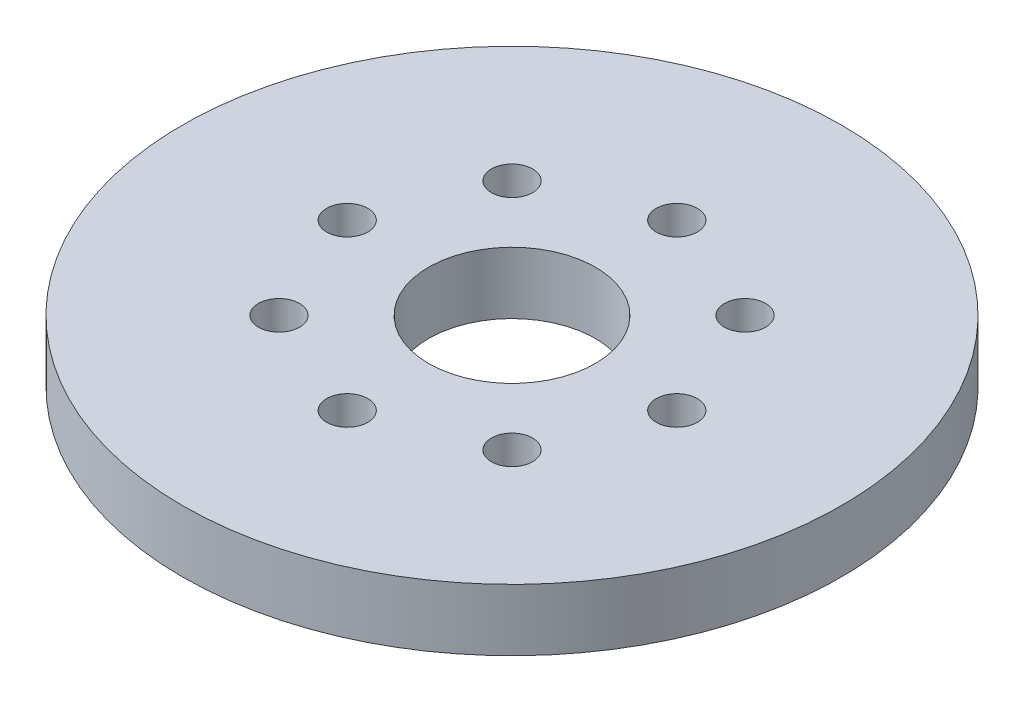
ISO-10303-21;
HEADER;
FILE_DESCRIPTION(('STEP AP214'),'2;1');
FILE_NAME('part.step','',(''),(''),'','','');
FILE_SCHEMA(('AUTOMOTIVE_DESIGN { 1 0 10303 214 1 1 1 1 }'));
ENDSEC;
DATA;
#1=APPLICATION_CONTEXT('core data for automotive mechanical design processes');
#2=APPLICATION_PROTOCOL_DEFINITION('international standard','automotive_design',2000,#1);
#3=PRODUCT_CONTEXT('',#1,'mechanical');
#4=PRODUCT('Part','Part','',(#3));
#5=PRODUCT_RELATED_PRODUCT_CATEGORY('part','',(#4));
#6=PRODUCT_DEFINITION_FORMATION('','',#4);
#7=PRODUCT_DEFINITION_CONTEXT('part definition',#1,'design');
#8=PRODUCT_DEFINITION('design','',#6,#7);
#9=PRODUCT_DEFINITION_SHAPE('','',#8);
#10=(LENGTH_UNIT() NAMED_UNIT(*) SI_UNIT(.MILLI.,.METRE.));
#11=(NAMED_UNIT(*) PLANE_ANGLE_UNIT() SI_UNIT($,.RADIAN.));
#12=(NAMED_UNIT(*) SI_UNIT($,.STERADIAN.) SOLID_ANGLE_UNIT());
#13=UNCERTAINTY_MEASURE_WITH_UNIT(LENGTH_MEASURE(1.E-05),#10,'distance_accuracy_value','');
#14=(GEOMETRIC_REPRESENTATION_CONTEXT(3) GLOBAL_UNCERTAINTY_ASSIGNED_CONTEXT((#13)) GLOBAL_UNIT_ASSIGNED_CONTEXT((#10,
#11,#12)) REPRESENTATION_CONTEXT('',''));
#15=CARTESIAN_POINT('',(0.,0.,0.));
#16=DIRECTION('',(0.,0.,1.));
#17=DIRECTION('',(1.,0.,0.));
#18=AXIS2_PLACEMENT_3D('',#15,#16,#17);
#19=CARTESIAN_POINT('',(0.,3.,0.));
#20=DIRECTION('',(0.,1.,0.));
#21=DIRECTION('',(0.,0.,1.));
#22=AXIS2_PLACEMENT_3D('',#19,#20,#21);
#23=PLANE('',#22);
#24=CARTESIAN_POINT('',(-8.,3.,0.));
#25=DIRECTION('',(0.,1.,0.));
#26=DIRECTION('',(0.,0.,1.));
#27=AXIS2_PLACEMENT_3D('',#24,#25,#26);
#28=CIRCLE('',#27,1.);
#29=CARTESIAN_POINT('',(-8.,3.,0.999999999999917));
#30=VERTEX_POINT('',#29);
#31=EDGE_CURVE('E85',#30,#30,#28,.T.);
#32=ORIENTED_EDGE('',*,*,#31,.F.);
#33=EDGE_LOOP('',(#32));
#34=FACE_BOUND('',#33,.T.);
#35=CARTESIAN_POINT('',(0.,3.,8.));
#36=DIRECTION('',(0.,1.,0.));
#37=DIRECTION('',(0.,0.,1.));
#38=AXIS2_PLACEMENT_3D('',#35,#36,#37);
#39=CIRCLE('',#38,1.);
#40=CARTESIAN_POINT('',(0.,3.,9.));
#41=VERTEX_POINT('',#40);
#42=EDGE_CURVE('E73',#41,#41,#39,.T.);
#43=ORIENTED_EDGE('',*,*,#42,.F.);
#44=EDGE_LOOP('',(#43));
#45=FACE_BOUND('',#44,.T.);
#46=CARTESIAN_POINT('',(8.,3.,0.));
#47=DIRECTION('',(0.,1.,0.));
#48=DIRECTION('',(0.,0.,1.));
#49=AXIS2_PLACEMENT_3D('',#46,#47,#48);
#50=CIRCLE('',#49,1.);
#51=CARTESIAN_POINT('',(8.,3.,1.00000000000003));
#52=VERTEX_POINT('',#51);
#53=EDGE_CURVE('E61',#52,#52,#50,.T.);
#54=ORIENTED_EDGE('',*,*,#53,.F.);
#55=EDGE_LOOP('',(#54));
#56=FACE_BOUND('',#55,.T.);
#57=CARTESIAN_POINT('',(0.,3.,-8.));
#58=DIRECTION('',(0.,1.,0.));
#59=DIRECTION('',(0.,0.,1.));
#60=AXIS2_PLACEMENT_3D('',#57,#58,#59);
#61=CIRCLE('',#60,1.);
#62=CARTESIAN_POINT('',(0.,3.,-7.));
#63=VERTEX_POINT('',#62);
#64=EDGE_CURVE('E49',#63,#63,#61,.T.);
#65=ORIENTED_EDGE('',*,*,#64,.F.);
#66=EDGE_LOOP('',(#65));
#67=FACE_BOUND('',#66,.T.);
#68=CARTESIAN_POINT('',(0.,3.,0.));
#69=DIRECTION('',(0.,1.,0.));
#70=DIRECTION('',(0.,0.,1.));
#71=AXIS2_PLACEMENT_3D('',#68,#69,#70);
#72=CIRCLE('',#71,16.);
#73=CARTESIAN_POINT('',(0.,3.,16.));
#74=VERTEX_POINT('',#73);
#75=EDGE_CURVE('E10',#74,#74,#72,.T.);
#76=ORIENTED_EDGE('',*,*,#75,.T.);
#77=EDGE_LOOP('',(#76));
#78=FACE_BOUND('',#77,.T.);
#79=CARTESIAN_POINT('',(0.,3.,0.));
#80=DIRECTION('',(0.,1.,0.));
#81=DIRECTION('',(0.,0.,1.));
#82=AXIS2_PLACEMENT_3D('',#79,#80,#81);
#83=CIRCLE('',#82,4.05);
#84=CARTESIAN_POINT('',(0.,3.,4.05));
#85=VERTEX_POINT('',#84);
#86=EDGE_CURVE('E44',#85,#85,#83,.T.);
#87=ORIENTED_EDGE('',*,*,#86,.F.);
#88=EDGE_LOOP('',(#87));
#89=FACE_BOUND('',#88,.T.);
#90=CARTESIAN_POINT('',(5.65685424949239,3.,-5.65685424949237));
#91=DIRECTION('',(0.,1.,0.));
#92=DIRECTION('',(0.,0.,1.));
#93=AXIS2_PLACEMENT_3D('',#90,#91,#92);
#94=CIRCLE('',#93,1.);
#95=CARTESIAN_POINT('',(5.65685424949239,3.,-4.65685424949237));
#96=VERTEX_POINT('',#95);
#97=EDGE_CURVE('E55',#96,#96,#94,.T.);
#98=ORIENTED_EDGE('',*,*,#97,.F.);
#99=EDGE_LOOP('',(#98));
#100=FACE_BOUND('',#99,.T.);
#101=CARTESIAN_POINT('',(5.65685424949235,3.,5.65685424949241));
#102=DIRECTION('',(0.,1.,0.));
#103=DIRECTION('',(0.,0.,1.));
#104=AXIS2_PLACEMENT_3D('',#101,#102,#103);
#105=CIRCLE('',#104,1.);
#106=CARTESIAN_POINT('',(5.65685424949235,3.,6.65685424949241));
#107=VERTEX_POINT('',#106);
#108=EDGE_CURVE('E67',#107,#107,#105,.T.);
#109=ORIENTED_EDGE('',*,*,#108,.F.);
#110=EDGE_LOOP('',(#109));
#111=FACE_BOUND('',#110,.T.);
#112=CARTESIAN_POINT('',(-5.65685424949243,3.,5.65685424949233));
#113=DIRECTION('',(0.,1.,0.));
#114=DIRECTION('',(0.,0.,1.));
#115=AXIS2_PLACEMENT_3D('',#112,#113,#114);
#116=CIRCLE('',#115,1.);
#117=CARTESIAN_POINT('',(-5.65685424949243,3.,6.65685424949233));
#118=VERTEX_POINT('',#117);
#119=EDGE_CURVE('E79',#118,#118,#116,.T.);
#120=ORIENTED_EDGE('',*,*,#119,.F.);
#121=EDGE_LOOP('',(#120));
#122=FACE_BOUND('',#121,.T.);
#123=CARTESIAN_POINT('',(-5.65685424949231,3.,-5.65685424949245));
#124=DIRECTION('',(0.,1.,0.));
#125=DIRECTION('',(0.,0.,1.));
#126=AXIS2_PLACEMENT_3D('',#123,#124,#125);
#127=CIRCLE('',#126,1.);
#128=CARTESIAN_POINT('',(-5.65685424949231,3.,-4.65685424949245));
#129=VERTEX_POINT('',#128);
#130=EDGE_CURVE('E91',#129,#129,#127,.T.);
#131=ORIENTED_EDGE('',*,*,#130,.F.);
#132=EDGE_LOOP('',(#131));
#133=FACE_BOUND('',#132,.T.);
#134=ADVANCED_FACE('F33',(#34,#45,#56,#67,#78,#89,#100,#111,#122,#133),#23,.T.);
#135=CARTESIAN_POINT('',(0.,0.,0.));
#136=DIRECTION('',(0.,1.,0.));
#137=DIRECTION('',(0.,0.,1.));
#138=AXIS2_PLACEMENT_3D('',#135,#136,#137);
#139=PLANE('',#138);
#140=CARTESIAN_POINT('',(-8.,0.,0.));
#141=DIRECTION('',(0.,1.,0.));
#142=DIRECTION('',(0.,0.,1.));
#143=AXIS2_PLACEMENT_3D('',#140,#141,#142);
#144=CIRCLE('',#143,1.);
#145=CARTESIAN_POINT('',(-8.,0.,0.999999999999917));
#146=VERTEX_POINT('',#145);
#147=EDGE_CURVE('E88',#146,#146,#144,.T.);
#148=ORIENTED_EDGE('',*,*,#147,.T.);
#149=EDGE_LOOP('',(#148));
#150=FACE_BOUND('',#149,.T.);
#151=CARTESIAN_POINT('',(0.,0.,8.));
#152=DIRECTION('',(0.,1.,0.));
#153=DIRECTION('',(0.,0.,1.));
#154=AXIS2_PLACEMENT_3D('',#151,#152,#153);
#155=CIRCLE('',#154,1.);
#156=CARTESIAN_POINT('',(0.,0.,9.));
#157=VERTEX_POINT('',#156);
#158=EDGE_CURVE('E76',#157,#157,#155,.T.);
#159=ORIENTED_EDGE('',*,*,#158,.T.);
#160=EDGE_LOOP('',(#159));
#161=FACE_BOUND('',#160,.T.);
#162=CARTESIAN_POINT('',(8.,0.,0.));
#163=DIRECTION('',(0.,1.,0.));
#164=DIRECTION('',(0.,0.,1.));
#165=AXIS2_PLACEMENT_3D('',#162,#163,#164);
#166=CIRCLE('',#165,1.);
#167=CARTESIAN_POINT('',(8.,0.,1.00000000000003));
#168=VERTEX_POINT('',#167);
#169=EDGE_CURVE('E64',#168,#168,#166,.T.);
#170=ORIENTED_EDGE('',*,*,#169,.T.);
#171=EDGE_LOOP('',(#170));
#172=FACE_BOUND('',#171,.T.);
#173=CARTESIAN_POINT('',(0.,0.,-8.));
#174=DIRECTION('',(0.,1.,0.));
#175=DIRECTION('',(0.,0.,1.));
#176=AXIS2_PLACEMENT_3D('',#173,#174,#175);
#177=CIRCLE('',#176,1.);
#178=CARTESIAN_POINT('',(0.,0.,-7.));
#179=VERTEX_POINT('',#178);
#180=EDGE_CURVE('E52',#179,#179,#177,.T.);
#181=ORIENTED_EDGE('',*,*,#180,.T.);
#182=EDGE_LOOP('',(#181));
#183=FACE_BOUND('',#182,.T.);
#184=CARTESIAN_POINT('',(0.,0.,0.));
#185=DIRECTION('',(0.,1.,0.));
#186=DIRECTION('',(0.,0.,1.));
#187=AXIS2_PLACEMENT_3D('',#184,#185,#186);
#188=CIRCLE('',#187,16.);
#189=CARTESIAN_POINT('',(0.,0.,16.));
#190=VERTEX_POINT('',#189);
#191=EDGE_CURVE('E37',#190,#190,#188,.T.);
#192=ORIENTED_EDGE('',*,*,#191,.F.);
#193=EDGE_LOOP('',(#192));
#194=FACE_BOUND('',#193,.T.);
#195=CARTESIAN_POINT('',(0.,0.,0.));
#196=DIRECTION('',(0.,1.,0.));
#197=DIRECTION('',(0.,0.,1.));
#198=AXIS2_PLACEMENT_3D('',#195,#196,#197);
#199=CIRCLE('',#198,4.05);
#200=CARTESIAN_POINT('',(0.,0.,4.05));
#201=VERTEX_POINT('',#200);
#202=EDGE_CURVE('E46',#201,#201,#199,.T.);
#203=ORIENTED_EDGE('',*,*,#202,.T.);
#204=EDGE_LOOP('',(#203));
#205=FACE_BOUND('',#204,.T.);
#206=CARTESIAN_POINT('',(5.65685424949239,0.,-5.65685424949237));
#207=DIRECTION('',(0.,1.,0.));
#208=DIRECTION('',(0.,0.,1.));
#209=AXIS2_PLACEMENT_3D('',#206,#207,#208);
#210=CIRCLE('',#209,1.);
#211=CARTESIAN_POINT('',(5.65685424949239,0.,-4.65685424949237));
#212=VERTEX_POINT('',#211);
#213=EDGE_CURVE('E58',#212,#212,#210,.T.);
#214=ORIENTED_EDGE('',*,*,#213,.T.);
#215=EDGE_LOOP('',(#214));
#216=FACE_BOUND('',#215,.T.);
#217=CARTESIAN_POINT('',(5.65685424949235,0.,5.65685424949241));
#218=DIRECTION('',(0.,1.,0.));
#219=DIRECTION('',(0.,0.,1.));
#220=AXIS2_PLACEMENT_3D('',#217,#218,#219);
#221=CIRCLE('',#220,1.);
#222=CARTESIAN_POINT('',(5.65685424949235,0.,6.65685424949241));
#223=VERTEX_POINT('',#222);
#224=EDGE_CURVE('E70',#223,#223,#221,.T.);
#225=ORIENTED_EDGE('',*,*,#224,.T.);
#226=EDGE_LOOP('',(#225));
#227=FACE_BOUND('',#226,.T.);
#228=CARTESIAN_POINT('',(-5.65685424949243,0.,5.65685424949233));
#229=DIRECTION('',(0.,1.,0.));
#230=DIRECTION('',(0.,0.,1.));
#231=AXIS2_PLACEMENT_3D('',#228,#229,#230);
#232=CIRCLE('',#231,1.);
#233=CARTESIAN_POINT('',(-5.65685424949243,0.,6.65685424949233));
#234=VERTEX_POINT('',#233);
#235=EDGE_CURVE('E82',#234,#234,#232,.T.);
#236=ORIENTED_EDGE('',*,*,#235,.T.);
#237=EDGE_LOOP('',(#236));
#238=FACE_BOUND('',#237,.T.);
#239=CARTESIAN_POINT('',(-5.65685424949231,0.,-5.65685424949245));
#240=DIRECTION('',(0.,1.,0.));
#241=DIRECTION('',(0.,0.,1.));
#242=AXIS2_PLACEMENT_3D('',#239,#240,#241);
#243=CIRCLE('',#242,1.);
#244=CARTESIAN_POINT('',(-5.65685424949231,0.,-4.65685424949245));
#245=VERTEX_POINT('',#244);
#246=EDGE_CURVE('E94',#245,#245,#243,.T.);
#247=ORIENTED_EDGE('',*,*,#246,.T.);
#248=EDGE_LOOP('',(#247));
#249=FACE_BOUND('',#248,.T.);
#250=ADVANCED_FACE('F104',(#150,#161,#172,#183,#194,#205,#216,#227,#238,#249),#139,.F.);
#251=CARTESIAN_POINT('',(0.,3.,0.));
#252=DIRECTION('',(0.,-1.,0.));
#253=DIRECTION('',(0.,0.,-1.));
#254=AXIS2_PLACEMENT_3D('',#251,#252,#253);
#255=CYLINDRICAL_SURFACE('',#254,16.);
#256=ORIENTED_EDGE('',*,*,#75,.F.);
#257=EDGE_LOOP('',(#256));
#258=FACE_BOUND('',#257,.T.);
#259=ORIENTED_EDGE('',*,*,#191,.T.);
#260=EDGE_LOOP('',(#259));
#261=FACE_BOUND('',#260,.T.);
#262=ADVANCED_FACE('F35',(#258,#261),#255,.T.);
#263=CARTESIAN_POINT('',(0.,3.,0.));
#264=DIRECTION('',(0.,-1.,0.));
#265=DIRECTION('',(0.,0.,-1.));
#266=AXIS2_PLACEMENT_3D('',#263,#264,#265);
#267=CYLINDRICAL_SURFACE('',#266,4.05);
#268=ORIENTED_EDGE('',*,*,#86,.T.);
#269=EDGE_LOOP('',(#268));
#270=FACE_BOUND('',#269,.T.);
#271=ORIENTED_EDGE('',*,*,#202,.F.);
#272=EDGE_LOOP('',(#271));
#273=FACE_BOUND('',#272,.T.);
#274=ADVANCED_FACE('F114',(#270,#273),#267,.F.);
#275=CARTESIAN_POINT('',(0.,3.,-8.));
#276=DIRECTION('',(0.,-1.,0.));
#277=DIRECTION('',(0.,0.,-1.));
#278=AXIS2_PLACEMENT_3D('',#275,#276,#277);
#279=CYLINDRICAL_SURFACE('',#278,1.);
#280=ORIENTED_EDGE('',*,*,#64,.T.);
#281=EDGE_LOOP('',(#280));
#282=FACE_BOUND('',#281,.T.);
#283=ORIENTED_EDGE('',*,*,#180,.F.);
#284=EDGE_LOOP('',(#283));
#285=FACE_BOUND('',#284,.T.);
#286=ADVANCED_FACE('F117',(#282,#285),#279,.F.);
#287=CARTESIAN_POINT('',(5.65685424949239,3.,-5.65685424949237));
#288=DIRECTION('',(0.,-1.,0.));
#289=DIRECTION('',(0.,0.,-1.));
#290=AXIS2_PLACEMENT_3D('',#287,#288,#289);
#291=CYLINDRICAL_SURFACE('',#290,1.);
#292=ORIENTED_EDGE('',*,*,#97,.T.);
#293=EDGE_LOOP('',(#292));
#294=FACE_BOUND('',#293,.T.);
#295=ORIENTED_EDGE('',*,*,#213,.F.);
#296=EDGE_LOOP('',(#295));
#297=FACE_BOUND('',#296,.T.);
#298=ADVANCED_FACE('F121',(#294,#297),#291,.F.);
#299=CARTESIAN_POINT('',(8.,3.,0.));
#300=DIRECTION('',(0.,-1.,0.));
#301=DIRECTION('',(0.,0.,-1.));
#302=AXIS2_PLACEMENT_3D('',#299,#300,#301);
#303=CYLINDRICAL_SURFACE('',#302,1.);
#304=ORIENTED_EDGE('',*,*,#53,.T.);
#305=EDGE_LOOP('',(#304));
#306=FACE_BOUND('',#305,.T.);
#307=ORIENTED_EDGE('',*,*,#169,.F.);
#308=EDGE_LOOP('',(#307));
#309=FACE_BOUND('',#308,.T.);
#310=ADVANCED_FACE('F125',(#306,#309),#303,.F.);
#311=CARTESIAN_POINT('',(5.65685424949235,3.,5.65685424949241));
#312=DIRECTION('',(0.,-1.,0.));
#313=DIRECTION('',(0.,0.,-1.));
#314=AXIS2_PLACEMENT_3D('',#311,#312,#313);
#315=CYLINDRICAL_SURFACE('',#314,1.);
#316=ORIENTED_EDGE('',*,*,#108,.T.);
#317=EDGE_LOOP('',(#316));
#318=FACE_BOUND('',#317,.T.);
#319=ORIENTED_EDGE('',*,*,#224,.F.);
#320=EDGE_LOOP('',(#319));
#321=FACE_BOUND('',#320,.T.);
#322=ADVANCED_FACE('F129',(#318,#321),#315,.F.);
#323=CARTESIAN_POINT('',(0.,3.,8.));
#324=DIRECTION('',(0.,-1.,0.));
#325=DIRECTION('',(0.,0.,-1.));
#326=AXIS2_PLACEMENT_3D('',#323,#324,#325);
#327=CYLINDRICAL_SURFACE('',#326,1.);
#328=ORIENTED_EDGE('',*,*,#42,.T.);
#329=EDGE_LOOP('',(#328));
#330=FACE_BOUND('',#329,.T.);
#331=ORIENTED_EDGE('',*,*,#158,.F.);
#332=EDGE_LOOP('',(#331));
#333=FACE_BOUND('',#332,.T.);
#334=ADVANCED_FACE('F133',(#330,#333),#327,.F.);
#335=CARTESIAN_POINT('',(-5.65685424949243,3.,5.65685424949233));
#336=DIRECTION('',(0.,-1.,0.));
#337=DIRECTION('',(0.,0.,-1.));
#338=AXIS2_PLACEMENT_3D('',#335,#336,#337);
#339=CYLINDRICAL_SURFACE('',#338,1.);
#340=ORIENTED_EDGE('',*,*,#119,.T.);
#341=EDGE_LOOP('',(#340));
#342=FACE_BOUND('',#341,.T.);
#343=ORIENTED_EDGE('',*,*,#235,.F.);
#344=EDGE_LOOP('',(#343));
#345=FACE_BOUND('',#344,.T.);
#346=ADVANCED_FACE('F137',(#342,#345),#339,.F.);
#347=CARTESIAN_POINT('',(-8.,3.,0.));
#348=DIRECTION('',(0.,-1.,0.));
#349=DIRECTION('',(0.,0.,-1.));
#350=AXIS2_PLACEMENT_3D('',#347,#348,#349);
#351=CYLINDRICAL_SURFACE('',#350,1.);
#352=ORIENTED_EDGE('',*,*,#31,.T.);
#353=EDGE_LOOP('',(#352));
#354=FACE_BOUND('',#353,.T.);
#355=ORIENTED_EDGE('',*,*,#147,.F.);
#356=EDGE_LOOP('',(#355));
#357=FACE_BOUND('',#356,.T.);
#358=ADVANCED_FACE('F141',(#354,#357),#351,.F.);
#359=CARTESIAN_POINT('',(-5.65685424949231,3.,-5.65685424949245));
#360=DIRECTION('',(0.,-1.,0.));
#361=DIRECTION('',(0.,0.,-1.));
#362=AXIS2_PLACEMENT_3D('',#359,#360,#361);
#363=CYLINDRICAL_SURFACE('',#362,1.);
#364=ORIENTED_EDGE('',*,*,#130,.T.);
#365=EDGE_LOOP('',(#364));
#366=FACE_BOUND('',#365,.T.);
#367=ORIENTED_EDGE('',*,*,#246,.F.);
#368=EDGE_LOOP('',(#367));
#369=FACE_BOUND('',#368,.T.);
#370=ADVANCED_FACE('F100',(#366,#369),#363,.F.);
#371=CLOSED_SHELL('',(#134,#250,#262,#274,#286,#298,#310,#322,#334,#346,#358,#370));
#372=MANIFOLD_SOLID_BREP('B2',#371);
#373=ADVANCED_BREP_SHAPE_REPRESENTATION('',(#18,#372),#14);
#374=SHAPE_DEFINITION_REPRESENTATION(#9,#373);
ENDSEC;
END-ISO-10303-21;
